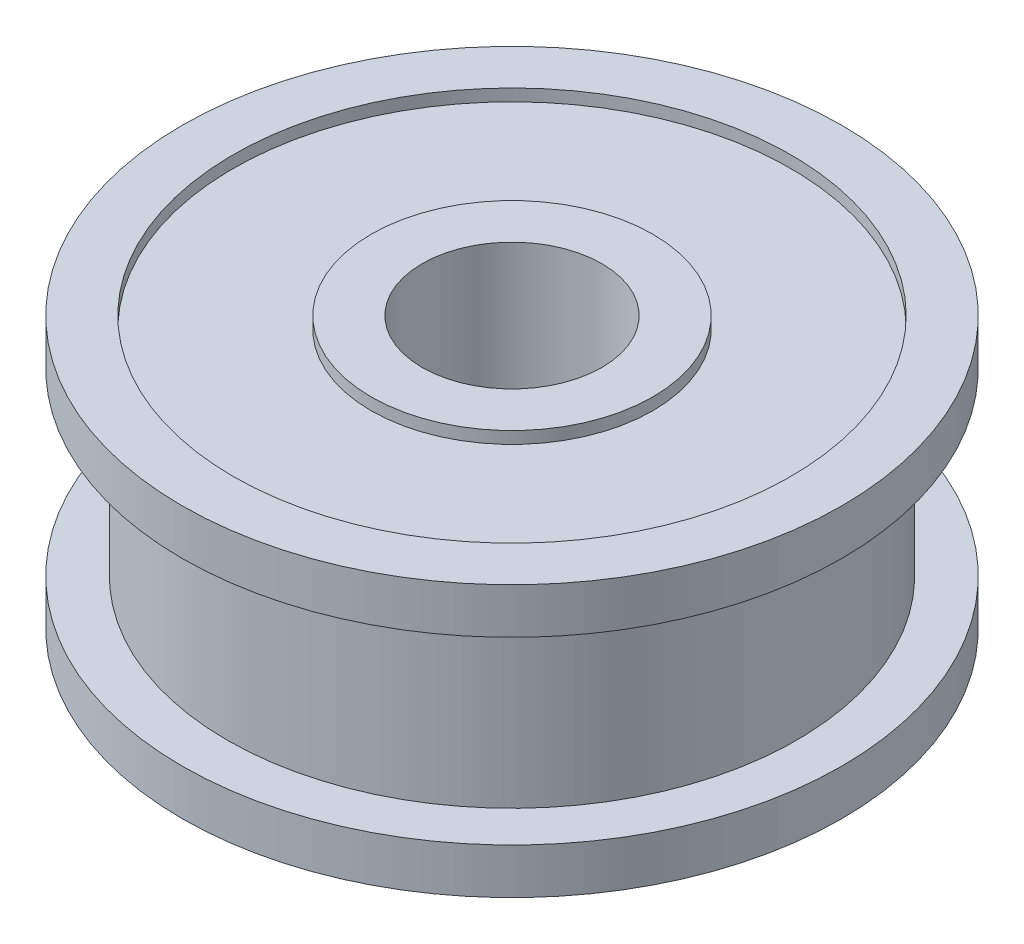
ISO-10303-21;
HEADER;
FILE_DESCRIPTION(('STEP AP214'),'2;1');
FILE_NAME('part.step','',(''),(''),'','','');
FILE_SCHEMA(('AUTOMOTIVE_DESIGN { 1 0 10303 214 1 1 1 1 }'));
ENDSEC;
DATA;
#1=APPLICATION_CONTEXT('core data for automotive mechanical design processes');
#2=APPLICATION_PROTOCOL_DEFINITION('international standard','automotive_design',2000,#1);
#3=PRODUCT_CONTEXT('',#1,'mechanical');
#4=PRODUCT('Part','Part','',(#3));
#5=PRODUCT_RELATED_PRODUCT_CATEGORY('part','',(#4));
#6=PRODUCT_DEFINITION_FORMATION('','',#4);
#7=PRODUCT_DEFINITION_CONTEXT('part definition',#1,'design');
#8=PRODUCT_DEFINITION('design','',#6,#7);
#9=PRODUCT_DEFINITION_SHAPE('','',#8);
#10=(LENGTH_UNIT() NAMED_UNIT(*) SI_UNIT(.MILLI.,.METRE.));
#11=(NAMED_UNIT(*) PLANE_ANGLE_UNIT() SI_UNIT($,.RADIAN.));
#12=(NAMED_UNIT(*) SI_UNIT($,.STERADIAN.) SOLID_ANGLE_UNIT());
#13=UNCERTAINTY_MEASURE_WITH_UNIT(LENGTH_MEASURE(1.E-05),#10,'distance_accuracy_value','');
#14=(GEOMETRIC_REPRESENTATION_CONTEXT(3) GLOBAL_UNCERTAINTY_ASSIGNED_CONTEXT((#13)) GLOBAL_UNIT_ASSIGNED_CONTEXT((#10,
#11,#12)) REPRESENTATION_CONTEXT('',''));
#15=CARTESIAN_POINT('',(0.,0.,0.));
#16=DIRECTION('',(0.,0.,1.));
#17=DIRECTION('',(1.,0.,0.));
#18=AXIS2_PLACEMENT_3D('',#15,#16,#17);
#19=CARTESIAN_POINT('',(0.,0.,0.));
#20=DIRECTION('',(0.,1.,0.));
#21=DIRECTION('',(0.,0.,1.));
#22=AXIS2_PLACEMENT_3D('',#19,#20,#21);
#23=PLANE('',#22);
#24=CARTESIAN_POINT('',(0.,0.,0.));
#25=DIRECTION('',(0.,-1.,0.));
#26=DIRECTION('',(0.,0.,-1.));
#27=AXIS2_PLACEMENT_3D('',#24,#25,#26);
#28=CIRCLE('',#27,1.5);
#29=CARTESIAN_POINT('',(0.,0.,-1.5));
#30=VERTEX_POINT('',#29);
#31=EDGE_CURVE('E58',#30,#30,#28,.T.);
#32=ORIENTED_EDGE('',*,*,#31,.F.);
#33=EDGE_LOOP('',(#32));
#34=FACE_BOUND('',#33,.T.);
#35=CARTESIAN_POINT('',(0.,0.,0.));
#36=DIRECTION('',(0.,-1.,0.));
#37=DIRECTION('',(0.,0.,-1.));
#38=AXIS2_PLACEMENT_3D('',#35,#36,#37);
#39=CIRCLE('',#38,2.35);
#40=CARTESIAN_POINT('',(0.,0.,-2.35));
#41=VERTEX_POINT('',#40);
#42=EDGE_CURVE('E80',#41,#41,#39,.T.);
#43=ORIENTED_EDGE('',*,*,#42,.T.);
#44=EDGE_LOOP('',(#43));
#45=FACE_BOUND('',#44,.T.);
#46=ADVANCED_FACE('F32',(#34,#45),#23,.F.);
#47=CARTESIAN_POINT('',(0.,4.52,0.));
#48=DIRECTION('',(0.,1.,0.));
#49=DIRECTION('',(0.,0.,1.));
#50=AXIS2_PLACEMENT_3D('',#47,#48,#49);
#51=PLANE('',#50);
#52=CARTESIAN_POINT('',(0.,4.52,0.));
#53=DIRECTION('',(0.,1.,0.));
#54=DIRECTION('',(0.,0.,1.));
#55=AXIS2_PLACEMENT_3D('',#52,#53,#54);
#56=CIRCLE('',#55,1.5);
#57=CARTESIAN_POINT('',(0.,4.52,1.5));
#58=VERTEX_POINT('',#57);
#59=EDGE_CURVE('E53',#58,#58,#56,.F.);
#60=ORIENTED_EDGE('',*,*,#59,.T.);
#61=EDGE_LOOP('',(#60));
#62=FACE_BOUND('',#61,.T.);
#63=CARTESIAN_POINT('',(0.,4.52,0.));
#64=DIRECTION('',(0.,1.,0.));
#65=DIRECTION('',(0.,0.,1.));
#66=AXIS2_PLACEMENT_3D('',#63,#64,#65);
#67=CIRCLE('',#66,2.35);
#68=CARTESIAN_POINT('',(0.,4.52,2.35));
#69=VERTEX_POINT('',#68);
#70=EDGE_CURVE('E68',#69,#69,#67,.T.);
#71=ORIENTED_EDGE('',*,*,#70,.T.);
#72=EDGE_LOOP('',(#71));
#73=FACE_BOUND('',#72,.T.);
#74=ADVANCED_FACE('F111',(#62,#73),#51,.T.);
#75=CARTESIAN_POINT('',(0.,0.76,0.));
#76=DIRECTION('',(0.,-1.,0.));
#77=DIRECTION('',(0.,0.,-1.));
#78=AXIS2_PLACEMENT_3D('',#75,#76,#77);
#79=CYLINDRICAL_SURFACE('',#78,5.5);
#80=CARTESIAN_POINT('',(0.,0.76,0.));
#81=DIRECTION('',(0.,1.,0.));
#82=DIRECTION('',(0.,0.,1.));
#83=AXIS2_PLACEMENT_3D('',#80,#81,#82);
#84=CIRCLE('',#83,5.5);
#85=CARTESIAN_POINT('',(0.,0.76,5.5));
#86=VERTEX_POINT('',#85);
#87=EDGE_CURVE('E40',#86,#86,#84,.T.);
#88=ORIENTED_EDGE('',*,*,#87,.F.);
#89=EDGE_LOOP('',(#88));
#90=FACE_BOUND('',#89,.T.);
#91=CARTESIAN_POINT('',(0.,0.,0.));
#92=DIRECTION('',(0.,1.,0.));
#93=DIRECTION('',(0.,0.,1.));
#94=AXIS2_PLACEMENT_3D('',#91,#92,#93);
#95=CIRCLE('',#94,5.5);
#96=CARTESIAN_POINT('',(0.,0.,5.5));
#97=VERTEX_POINT('',#96);
#98=EDGE_CURVE('E36',#97,#97,#95,.T.);
#99=ORIENTED_EDGE('',*,*,#98,.T.);
#100=EDGE_LOOP('',(#99));
#101=FACE_BOUND('',#100,.T.);
#102=ADVANCED_FACE('F34',(#90,#101),#79,.T.);
#103=CARTESIAN_POINT('',(0.,0.76,0.));
#104=DIRECTION('',(0.,1.,0.));
#105=DIRECTION('',(0.,0.,1.));
#106=AXIS2_PLACEMENT_3D('',#103,#104,#105);
#107=PLANE('',#106);
#108=CARTESIAN_POINT('',(0.,0.76,0.));
#109=DIRECTION('',(0.,1.,0.));
#110=DIRECTION('',(0.,0.,1.));
#111=AXIS2_PLACEMENT_3D('',#108,#109,#110);
#112=CIRCLE('',#111,4.75);
#113=CARTESIAN_POINT('',(0.,0.76,4.75));
#114=VERTEX_POINT('',#113);
#115=EDGE_CURVE('E10',#114,#114,#112,.T.);
#116=ORIENTED_EDGE('',*,*,#115,.F.);
#117=EDGE_LOOP('',(#116));
#118=FACE_BOUND('',#117,.T.);
#119=ORIENTED_EDGE('',*,*,#87,.T.);
#120=EDGE_LOOP('',(#119));
#121=FACE_BOUND('',#120,.T.);
#122=ADVANCED_FACE('F106',(#118,#121),#107,.T.);
#123=CARTESIAN_POINT('',(0.,0.,0.));
#124=DIRECTION('',(0.,-1.,0.));
#125=DIRECTION('',(0.,0.,-1.));
#126=AXIS2_PLACEMENT_3D('',#123,#124,#125);
#127=CIRCLE('',#126,4.65);
#128=CARTESIAN_POINT('',(0.,0.,-4.65));
#129=VERTEX_POINT('',#128);
#130=EDGE_CURVE('E74',#129,#129,#127,.T.);
#131=ORIENTED_EDGE('',*,*,#130,.F.);
#132=EDGE_LOOP('',(#131));
#133=FACE_BOUND('',#132,.T.);
#134=ORIENTED_EDGE('',*,*,#98,.F.);
#135=EDGE_LOOP('',(#134));
#136=FACE_BOUND('',#135,.T.);
#137=ADVANCED_FACE('F102',(#133,#136),#23,.F.);
#138=CARTESIAN_POINT('',(0.,3.76,0.));
#139=DIRECTION('',(0.,-1.,0.));
#140=DIRECTION('',(0.,0.,-1.));
#141=AXIS2_PLACEMENT_3D('',#138,#139,#140);
#142=CYLINDRICAL_SURFACE('',#141,4.75);
#143=CARTESIAN_POINT('',(0.,3.76,0.));
#144=DIRECTION('',(0.,1.,0.));
#145=DIRECTION('',(0.,0.,1.));
#146=AXIS2_PLACEMENT_3D('',#143,#144,#145);
#147=CIRCLE('',#146,4.75);
#148=CARTESIAN_POINT('',(0.,3.76,4.75));
#149=VERTEX_POINT('',#148);
#150=EDGE_CURVE('E46',#149,#149,#147,.T.);
#151=ORIENTED_EDGE('',*,*,#150,.F.);
#152=EDGE_LOOP('',(#151));
#153=FACE_BOUND('',#152,.T.);
#154=ORIENTED_EDGE('',*,*,#115,.T.);
#155=EDGE_LOOP('',(#154));
#156=FACE_BOUND('',#155,.T.);
#157=ADVANCED_FACE('F105',(#153,#156),#142,.T.);
#158=CARTESIAN_POINT('',(0.,4.52,0.));
#159=DIRECTION('',(0.,-1.,0.));
#160=DIRECTION('',(0.,0.,-1.));
#161=AXIS2_PLACEMENT_3D('',#158,#159,#160);
#162=CYLINDRICAL_SURFACE('',#161,5.5);
#163=CARTESIAN_POINT('',(0.,4.52,0.));
#164=DIRECTION('',(0.,1.,0.));
#165=DIRECTION('',(0.,0.,1.));
#166=AXIS2_PLACEMENT_3D('',#163,#164,#165);
#167=CIRCLE('',#166,5.5);
#168=CARTESIAN_POINT('',(0.,4.52,5.5));
#169=VERTEX_POINT('',#168);
#170=EDGE_CURVE('E49',#169,#169,#167,.T.);
#171=ORIENTED_EDGE('',*,*,#170,.F.);
#172=EDGE_LOOP('',(#171));
#173=FACE_BOUND('',#172,.T.);
#174=CARTESIAN_POINT('',(0.,3.76,0.));
#175=DIRECTION('',(0.,1.,0.));
#176=DIRECTION('',(0.,0.,1.));
#177=AXIS2_PLACEMENT_3D('',#174,#175,#176);
#178=CIRCLE('',#177,5.5);
#179=CARTESIAN_POINT('',(0.,3.76,5.5));
#180=VERTEX_POINT('',#179);
#181=EDGE_CURVE('E50',#180,#180,#178,.T.);
#182=ORIENTED_EDGE('',*,*,#181,.T.);
#183=EDGE_LOOP('',(#182));
#184=FACE_BOUND('',#183,.T.);
#185=ADVANCED_FACE('F132',(#173,#184),#162,.T.);
#186=CARTESIAN_POINT('',(0.,4.52,0.));
#187=DIRECTION('',(0.,1.,0.));
#188=DIRECTION('',(0.,0.,1.));
#189=AXIS2_PLACEMENT_3D('',#186,#187,#188);
#190=CIRCLE('',#189,4.65);
#191=CARTESIAN_POINT('',(0.,4.52,4.65));
#192=VERTEX_POINT('',#191);
#193=EDGE_CURVE('E62',#192,#192,#190,.T.);
#194=ORIENTED_EDGE('',*,*,#193,.F.);
#195=EDGE_LOOP('',(#194));
#196=FACE_BOUND('',#195,.T.);
#197=ORIENTED_EDGE('',*,*,#170,.T.);
#198=EDGE_LOOP('',(#197));
#199=FACE_BOUND('',#198,.T.);
#200=ADVANCED_FACE('F121',(#196,#199),#51,.T.);
#201=CARTESIAN_POINT('',(0.,3.76,0.));
#202=DIRECTION('',(0.,1.,0.));
#203=DIRECTION('',(0.,0.,1.));
#204=AXIS2_PLACEMENT_3D('',#201,#202,#203);
#205=PLANE('',#204);
#206=ORIENTED_EDGE('',*,*,#150,.T.);
#207=EDGE_LOOP('',(#206));
#208=FACE_BOUND('',#207,.T.);
#209=ORIENTED_EDGE('',*,*,#181,.F.);
#210=EDGE_LOOP('',(#209));
#211=FACE_BOUND('',#210,.T.);
#212=ADVANCED_FACE('F137',(#208,#211),#205,.F.);
#213=CARTESIAN_POINT('',(0.,8.76264068711929,0.));
#214=DIRECTION('',(0.,-1.,0.));
#215=DIRECTION('',(0.,0.,-1.));
#216=AXIS2_PLACEMENT_3D('',#213,#214,#215);
#217=CYLINDRICAL_SURFACE('',#216,1.5);
#218=ORIENTED_EDGE('',*,*,#31,.T.);
#219=EDGE_LOOP('',(#218));
#220=FACE_BOUND('',#219,.T.);
#221=ORIENTED_EDGE('',*,*,#59,.F.);
#222=EDGE_LOOP('',(#221));
#223=FACE_BOUND('',#222,.T.);
#224=ADVANCED_FACE('F139',(#220,#223),#217,.F.);
#225=CARTESIAN_POINT('',(0.,4.32,0.));
#226=DIRECTION('',(0.,1.,0.));
#227=DIRECTION('',(0.,0.,1.));
#228=AXIS2_PLACEMENT_3D('',#225,#226,#227);
#229=CYLINDRICAL_SURFACE('',#228,4.65);
#230=CARTESIAN_POINT('',(0.,4.32,0.));
#231=DIRECTION('',(0.,1.,0.));
#232=DIRECTION('',(0.,0.,1.));
#233=AXIS2_PLACEMENT_3D('',#230,#231,#232);
#234=CIRCLE('',#233,4.65);
#235=CARTESIAN_POINT('',(0.,4.32,4.65));
#236=VERTEX_POINT('',#235);
#237=EDGE_CURVE('E61',#236,#236,#234,.T.);
#238=ORIENTED_EDGE('',*,*,#237,.F.);
#239=EDGE_LOOP('',(#238));
#240=FACE_BOUND('',#239,.T.);
#241=ORIENTED_EDGE('',*,*,#193,.T.);
#242=EDGE_LOOP('',(#241));
#243=FACE_BOUND('',#242,.T.);
#244=ADVANCED_FACE('F146',(#240,#243),#229,.F.);
#245=CARTESIAN_POINT('',(0.,4.32,0.));
#246=DIRECTION('',(0.,1.,0.));
#247=DIRECTION('',(0.,0.,1.));
#248=AXIS2_PLACEMENT_3D('',#245,#246,#247);
#249=PLANE('',#248);
#250=CARTESIAN_POINT('',(0.,4.32,0.));
#251=DIRECTION('',(0.,1.,0.));
#252=DIRECTION('',(0.,0.,1.));
#253=AXIS2_PLACEMENT_3D('',#250,#251,#252);
#254=CIRCLE('',#253,2.35);
#255=CARTESIAN_POINT('',(0.,4.32,2.35));
#256=VERTEX_POINT('',#255);
#257=EDGE_CURVE('E65',#256,#256,#254,.T.);
#258=ORIENTED_EDGE('',*,*,#257,.F.);
#259=EDGE_LOOP('',(#258));
#260=FACE_BOUND('',#259,.T.);
#261=ORIENTED_EDGE('',*,*,#237,.T.);
#262=EDGE_LOOP('',(#261));
#263=FACE_BOUND('',#262,.T.);
#264=ADVANCED_FACE('F150',(#260,#263),#249,.T.);
#265=CARTESIAN_POINT('',(0.,4.32,0.));
#266=DIRECTION('',(0.,1.,0.));
#267=DIRECTION('',(0.,0.,1.));
#268=AXIS2_PLACEMENT_3D('',#265,#266,#267);
#269=CYLINDRICAL_SURFACE('',#268,2.35);
#270=ORIENTED_EDGE('',*,*,#257,.T.);
#271=EDGE_LOOP('',(#270));
#272=FACE_BOUND('',#271,.T.);
#273=ORIENTED_EDGE('',*,*,#70,.F.);
#274=EDGE_LOOP('',(#273));
#275=FACE_BOUND('',#274,.T.);
#276=ADVANCED_FACE('F98',(#272,#275),#269,.T.);
#277=CARTESIAN_POINT('',(0.,0.2,0.));
#278=DIRECTION('',(0.,-1.,0.));
#279=DIRECTION('',(0.,0.,-1.));
#280=AXIS2_PLACEMENT_3D('',#277,#278,#279);
#281=CYLINDRICAL_SURFACE('',#280,4.65);
#282=CARTESIAN_POINT('',(0.,0.2,0.));
#283=DIRECTION('',(0.,-1.,0.));
#284=DIRECTION('',(0.,0.,-1.));
#285=AXIS2_PLACEMENT_3D('',#282,#283,#284);
#286=CIRCLE('',#285,4.65);
#287=CARTESIAN_POINT('',(0.,0.2,-4.65));
#288=VERTEX_POINT('',#287);
#289=EDGE_CURVE('E71',#288,#288,#286,.T.);
#290=ORIENTED_EDGE('',*,*,#289,.F.);
#291=EDGE_LOOP('',(#290));
#292=FACE_BOUND('',#291,.T.);
#293=ORIENTED_EDGE('',*,*,#130,.T.);
#294=EDGE_LOOP('',(#293));
#295=FACE_BOUND('',#294,.T.);
#296=ADVANCED_FACE('F92',(#292,#295),#281,.F.);
#297=CARTESIAN_POINT('',(0.,0.2,0.));
#298=DIRECTION('',(0.,-1.,0.));
#299=DIRECTION('',(0.,0.,-1.));
#300=AXIS2_PLACEMENT_3D('',#297,#298,#299);
#301=PLANE('',#300);
#302=CARTESIAN_POINT('',(0.,0.2,0.));
#303=DIRECTION('',(0.,-1.,0.));
#304=DIRECTION('',(0.,0.,-1.));
#305=AXIS2_PLACEMENT_3D('',#302,#303,#304);
#306=CIRCLE('',#305,2.35);
#307=CARTESIAN_POINT('',(0.,0.2,-2.35));
#308=VERTEX_POINT('',#307);
#309=EDGE_CURVE('E77',#308,#308,#306,.T.);
#310=ORIENTED_EDGE('',*,*,#309,.F.);
#311=EDGE_LOOP('',(#310));
#312=FACE_BOUND('',#311,.T.);
#313=ORIENTED_EDGE('',*,*,#289,.T.);
#314=EDGE_LOOP('',(#313));
#315=FACE_BOUND('',#314,.T.);
#316=ADVANCED_FACE('F89',(#312,#315),#301,.T.);
#317=CARTESIAN_POINT('',(0.,0.2,0.));
#318=DIRECTION('',(0.,-1.,0.));
#319=DIRECTION('',(0.,0.,-1.));
#320=AXIS2_PLACEMENT_3D('',#317,#318,#319);
#321=CYLINDRICAL_SURFACE('',#320,2.35);
#322=ORIENTED_EDGE('',*,*,#309,.T.);
#323=EDGE_LOOP('',(#322));
#324=FACE_BOUND('',#323,.T.);
#325=ORIENTED_EDGE('',*,*,#42,.F.);
#326=EDGE_LOOP('',(#325));
#327=FACE_BOUND('',#326,.T.);
#328=ADVANCED_FACE('F86',(#324,#327),#321,.T.);
#329=CLOSED_SHELL('',(#46,#74,#102,#122,#137,#157,#185,#200,#212,#224,#244,#264,#276,#296,#316,#328));
#330=MANIFOLD_SOLID_BREP('B2',#329);
#331=ADVANCED_BREP_SHAPE_REPRESENTATION('',(#18,#330),#14);
#332=SHAPE_DEFINITION_REPRESENTATION(#9,#331);
ENDSEC;
END-ISO-10303-21;
